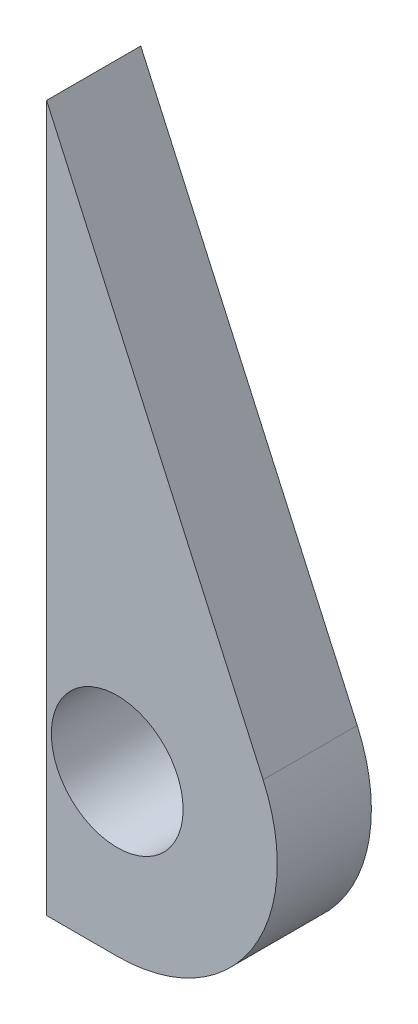
ISO-10303-21;
HEADER;
FILE_DESCRIPTION(('STEP AP214'),'2;1');
FILE_NAME('part.step','',(''),(''),'','','');
FILE_SCHEMA(('AUTOMOTIVE_DESIGN { 1 0 10303 214 1 1 1 1 }'));
ENDSEC;
DATA;
#1=APPLICATION_CONTEXT('core data for automotive mechanical design processes');
#2=APPLICATION_PROTOCOL_DEFINITION('international standard','automotive_design',2000,#1);
#3=PRODUCT_CONTEXT('',#1,'mechanical');
#4=PRODUCT('Part','Part','',(#3));
#5=PRODUCT_RELATED_PRODUCT_CATEGORY('part','',(#4));
#6=PRODUCT_DEFINITION_FORMATION('','',#4);
#7=PRODUCT_DEFINITION_CONTEXT('part definition',#1,'design');
#8=PRODUCT_DEFINITION('design','',#6,#7);
#9=PRODUCT_DEFINITION_SHAPE('','',#8);
#10=(LENGTH_UNIT() NAMED_UNIT(*) SI_UNIT(.MILLI.,.METRE.));
#11=(NAMED_UNIT(*) PLANE_ANGLE_UNIT() SI_UNIT($,.RADIAN.));
#12=(NAMED_UNIT(*) SI_UNIT($,.STERADIAN.) SOLID_ANGLE_UNIT());
#13=UNCERTAINTY_MEASURE_WITH_UNIT(LENGTH_MEASURE(1.E-05),#10,'distance_accuracy_value','');
#14=(GEOMETRIC_REPRESENTATION_CONTEXT(3) GLOBAL_UNCERTAINTY_ASSIGNED_CONTEXT((#13)) GLOBAL_UNIT_ASSIGNED_CONTEXT((#10,
#11,#12)) REPRESENTATION_CONTEXT('',''));
#15=CARTESIAN_POINT('',(0.,0.,0.));
#16=DIRECTION('',(0.,0.,1.));
#17=DIRECTION('',(1.,0.,0.));
#18=AXIS2_PLACEMENT_3D('',#15,#16,#17);
#19=CARTESIAN_POINT('',(0.,0.,2.));
#20=DIRECTION('',(0.,0.,1.));
#21=DIRECTION('',(1.,0.,0.));
#22=AXIS2_PLACEMENT_3D('',#19,#20,#21);
#23=PLANE('',#22);
#24=DIRECTION('',(0.,-1.,0.));
#25=VECTOR('',#24,1.);
#26=CARTESIAN_POINT('',(-1.5,3.6,2.));
#27=LINE('',#26,#25);
#28=CARTESIAN_POINT('',(-1.5,11.6,2.));
#29=VERTEX_POINT('',#28);
#30=CARTESIAN_POINT('',(-1.5,-3.4,2.));
#31=VERTEX_POINT('',#30);
#32=EDGE_CURVE('E51',#29,#31,#27,.T.);
#33=ORIENTED_EDGE('',*,*,#32,.T.);
#34=DIRECTION('',(1.,0.,0.));
#35=VECTOR('',#34,1.);
#36=CARTESIAN_POINT('',(0.,-3.4,2.));
#37=LINE('',#36,#35);
#38=CARTESIAN_POINT('',(0.,-3.4,2.));
#39=VERTEX_POINT('',#38);
#40=EDGE_CURVE('E81',#31,#39,#37,.T.);
#41=ORIENTED_EDGE('',*,*,#40,.T.);
#42=CARTESIAN_POINT('',(0.,0.,2.));
#43=DIRECTION('',(0.,0.,1.));
#44=DIRECTION('',(1.,0.,0.));
#45=AXIS2_PLACEMENT_3D('',#42,#43,#44);
#46=CIRCLE('',#45,3.4);
#47=CARTESIAN_POINT('',(3.09957852139478,1.39735929155967,2.));
#48=VERTEX_POINT('',#47);
#49=EDGE_CURVE('E85',#39,#48,#46,.T.);
#50=ORIENTED_EDGE('',*,*,#49,.T.);
#51=DIRECTION('',(-0.410988026929315,0.9116407415867,0.));
#52=VECTOR('',#51,1.);
#53=CARTESIAN_POINT('',(-1.5,11.6,2.));
#54=LINE('',#53,#52);
#55=EDGE_CURVE('E93',#48,#29,#54,.T.);
#56=ORIENTED_EDGE('',*,*,#55,.T.);
#57=EDGE_LOOP('',(#33,#41,#50,#56));
#58=FACE_BOUND('',#57,.T.);
#59=CARTESIAN_POINT('',(0.,0.,2.));
#60=DIRECTION('',(0.,0.,1.));
#61=DIRECTION('',(1.,0.,0.));
#62=AXIS2_PLACEMENT_3D('',#59,#60,#61);
#63=CIRCLE('',#62,1.4);
#64=CARTESIAN_POINT('',(1.4,0.,2.));
#65=VERTEX_POINT('',#64);
#66=EDGE_CURVE('E100',#65,#65,#63,.T.);
#67=ORIENTED_EDGE('',*,*,#66,.F.);
#68=EDGE_LOOP('',(#67));
#69=FACE_BOUND('',#68,.T.);
#70=ADVANCED_FACE('F34',(#58,#69),#23,.T.);
#71=CARTESIAN_POINT('',(0.,0.,0.));
#72=DIRECTION('',(0.,0.,1.));
#73=DIRECTION('',(1.,0.,0.));
#74=AXIS2_PLACEMENT_3D('',#71,#72,#73);
#75=PLANE('',#74);
#76=DIRECTION('',(1.,0.,0.));
#77=VECTOR('',#76,1.);
#78=CARTESIAN_POINT('',(0.,-3.4,0.));
#79=LINE('',#78,#77);
#80=CARTESIAN_POINT('',(-1.5,-3.4,0.));
#81=VERTEX_POINT('',#80);
#82=CARTESIAN_POINT('',(0.,-3.4,0.));
#83=VERTEX_POINT('',#82);
#84=EDGE_CURVE('E89',#81,#83,#79,.T.);
#85=ORIENTED_EDGE('',*,*,#84,.F.);
#86=DIRECTION('',(0.,-1.,0.));
#87=VECTOR('',#86,1.);
#88=CARTESIAN_POINT('',(-1.5,3.6,0.));
#89=LINE('',#88,#87);
#90=CARTESIAN_POINT('',(-1.5,11.6,0.));
#91=VERTEX_POINT('',#90);
#92=EDGE_CURVE('E103',#91,#81,#89,.T.);
#93=ORIENTED_EDGE('',*,*,#92,.F.);
#94=DIRECTION('',(-0.410988026929315,0.9116407415867,0.));
#95=VECTOR('',#94,1.);
#96=CARTESIAN_POINT('',(-1.5,11.6,0.));
#97=LINE('',#96,#95);
#98=CARTESIAN_POINT('',(3.09957852139478,1.39735929155967,0.));
#99=VERTEX_POINT('',#98);
#100=EDGE_CURVE('E76',#99,#91,#97,.T.);
#101=ORIENTED_EDGE('',*,*,#100,.F.);
#102=CARTESIAN_POINT('',(0.,0.,0.));
#103=DIRECTION('',(0.,0.,1.));
#104=DIRECTION('',(1.,0.,0.));
#105=AXIS2_PLACEMENT_3D('',#102,#103,#104);
#106=CIRCLE('',#105,3.4);
#107=EDGE_CURVE('E69',#83,#99,#106,.T.);
#108=ORIENTED_EDGE('',*,*,#107,.F.);
#109=EDGE_LOOP('',(#85,#93,#101,#108));
#110=FACE_BOUND('',#109,.T.);
#111=CARTESIAN_POINT('',(0.,0.,0.));
#112=DIRECTION('',(0.,0.,1.));
#113=DIRECTION('',(1.,0.,0.));
#114=AXIS2_PLACEMENT_3D('',#111,#112,#113);
#115=CIRCLE('',#114,1.4);
#116=CARTESIAN_POINT('',(1.4,0.,0.));
#117=VERTEX_POINT('',#116);
#118=EDGE_CURVE('E179',#117,#117,#115,.T.);
#119=ORIENTED_EDGE('',*,*,#118,.T.);
#120=EDGE_LOOP('',(#119));
#121=FACE_BOUND('',#120,.T.);
#122=ADVANCED_FACE('F109',(#110,#121),#75,.F.);
#123=CARTESIAN_POINT('',(0.,-3.4,2.));
#124=DIRECTION('',(0.,1.,0.));
#125=DIRECTION('',(0.,0.,1.));
#126=AXIS2_PLACEMENT_3D('',#123,#124,#125);
#127=PLANE('',#126);
#128=ORIENTED_EDGE('',*,*,#84,.T.);
#129=DIRECTION('',(0.,0.,-1.));
#130=VECTOR('',#129,1.);
#131=CARTESIAN_POINT('',(0.,-3.4,2.));
#132=LINE('',#131,#130);
#133=EDGE_CURVE('E43',#39,#83,#132,.T.);
#134=ORIENTED_EDGE('',*,*,#133,.F.);
#135=ORIENTED_EDGE('',*,*,#40,.F.);
#136=DIRECTION('',(0.,0.,-1.));
#137=VECTOR('',#136,1.);
#138=CARTESIAN_POINT('',(-1.5,-3.4,2.));
#139=LINE('',#138,#137);
#140=EDGE_CURVE('E11',#31,#81,#139,.T.);
#141=ORIENTED_EDGE('',*,*,#140,.T.);
#142=EDGE_LOOP('',(#128,#134,#135,#141));
#143=FACE_BOUND('',#142,.T.);
#144=ADVANCED_FACE('F36',(#143),#127,.F.);
#145=CARTESIAN_POINT('',(0.,0.,2.));
#146=DIRECTION('',(0.,0.,-1.));
#147=DIRECTION('',(-1.,0.,0.));
#148=AXIS2_PLACEMENT_3D('',#145,#146,#147);
#149=CYLINDRICAL_SURFACE('',#148,3.4);
#150=ORIENTED_EDGE('',*,*,#107,.T.);
#151=DIRECTION('',(0.,0.,-1.));
#152=VECTOR('',#151,1.);
#153=CARTESIAN_POINT('',(3.09957852139478,1.39735929155967,2.));
#154=LINE('',#153,#152);
#155=EDGE_CURVE('E90',#48,#99,#154,.T.);
#156=ORIENTED_EDGE('',*,*,#155,.F.);
#157=ORIENTED_EDGE('',*,*,#49,.F.);
#158=ORIENTED_EDGE('',*,*,#133,.T.);
#159=EDGE_LOOP('',(#150,#156,#157,#158));
#160=FACE_BOUND('',#159,.T.);
#161=ADVANCED_FACE('F91',(#160),#149,.T.);
#162=CARTESIAN_POINT('',(-1.5,11.6,2.));
#163=DIRECTION('',(-0.9116407415867,-0.410988026929315,0.));
#164=DIRECTION('',(0.410988026929315,-0.9116407415867,0.));
#165=AXIS2_PLACEMENT_3D('',#162,#163,#164);
#166=PLANE('',#165);
#167=ORIENTED_EDGE('',*,*,#100,.T.);
#168=DIRECTION('',(0.,0.,-1.));
#169=VECTOR('',#168,1.);
#170=CARTESIAN_POINT('',(-1.5,11.6,2.));
#171=LINE('',#170,#169);
#172=EDGE_CURVE('E95',#29,#91,#171,.T.);
#173=ORIENTED_EDGE('',*,*,#172,.F.);
#174=ORIENTED_EDGE('',*,*,#55,.F.);
#175=ORIENTED_EDGE('',*,*,#155,.T.);
#176=EDGE_LOOP('',(#167,#173,#174,#175));
#177=FACE_BOUND('',#176,.T.);
#178=ADVANCED_FACE('F106',(#177),#166,.F.);
#179=CARTESIAN_POINT('',(-1.5,3.6,2.));
#180=DIRECTION('',(1.,0.,0.));
#181=DIRECTION('',(0.,1.,0.));
#182=AXIS2_PLACEMENT_3D('',#179,#180,#181);
#183=PLANE('',#182);
#184=ORIENTED_EDGE('',*,*,#92,.T.);
#185=ORIENTED_EDGE('',*,*,#140,.F.);
#186=ORIENTED_EDGE('',*,*,#32,.F.);
#187=ORIENTED_EDGE('',*,*,#172,.T.);
#188=EDGE_LOOP('',(#184,#185,#186,#187));
#189=FACE_BOUND('',#188,.T.);
#190=ADVANCED_FACE('F111',(#189),#183,.F.);
#191=CARTESIAN_POINT('',(0.,0.,2.));
#192=DIRECTION('',(0.,0.,-1.));
#193=DIRECTION('',(-1.,0.,0.));
#194=AXIS2_PLACEMENT_3D('',#191,#192,#193);
#195=CYLINDRICAL_SURFACE('',#194,1.4);
#196=ORIENTED_EDGE('',*,*,#66,.T.);
#197=EDGE_LOOP('',(#196));
#198=FACE_BOUND('',#197,.T.);
#199=ORIENTED_EDGE('',*,*,#118,.F.);
#200=EDGE_LOOP('',(#199));
#201=FACE_BOUND('',#200,.T.);
#202=ADVANCED_FACE('F113',(#198,#201),#195,.F.);
#203=CLOSED_SHELL('',(#70,#122,#144,#161,#178,#190,#202));
#204=MANIFOLD_SOLID_BREP('B2',#203);
#205=ADVANCED_BREP_SHAPE_REPRESENTATION('',(#18,#204),#14);
#206=SHAPE_DEFINITION_REPRESENTATION(#9,#205);
ENDSEC;
END-ISO-10303-21;
